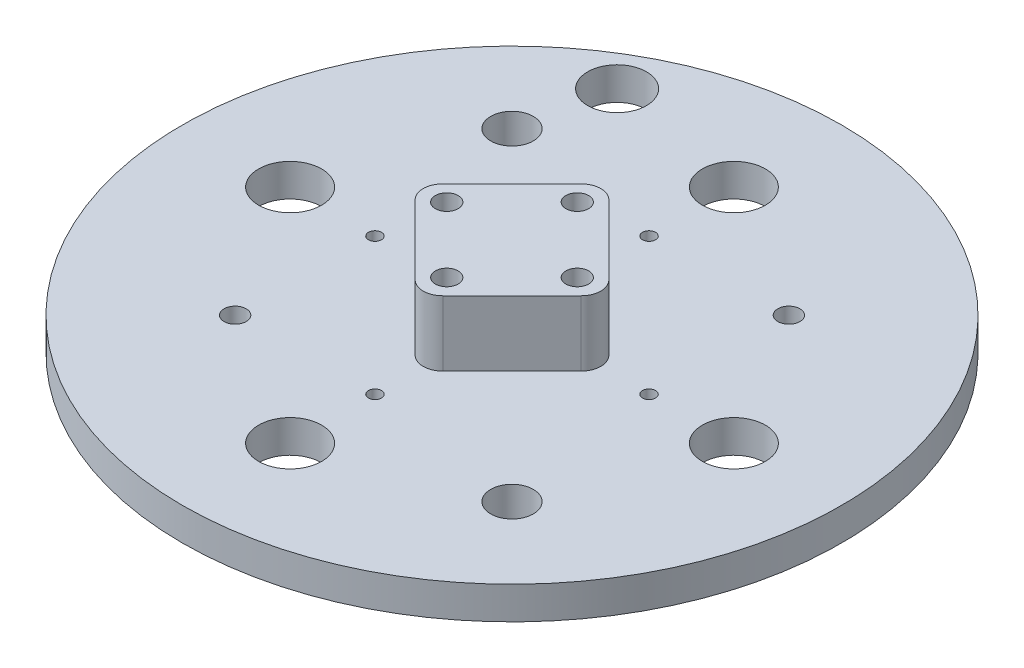
ISO-10303-21;
HEADER;
FILE_DESCRIPTION(('STEP AP214'),'2;1');
FILE_NAME('part.step','',(''),(''),'','','');
FILE_SCHEMA(('AUTOMOTIVE_DESIGN { 1 0 10303 214 1 1 1 1 }'));
ENDSEC;
DATA;
#1=APPLICATION_CONTEXT('core data for automotive mechanical design processes');
#2=APPLICATION_PROTOCOL_DEFINITION('international standard','automotive_design',2000,#1);
#3=PRODUCT_CONTEXT('',#1,'mechanical');
#4=PRODUCT('Part','Part','',(#3));
#5=PRODUCT_RELATED_PRODUCT_CATEGORY('part','',(#4));
#6=PRODUCT_DEFINITION_FORMATION('','',#4);
#7=PRODUCT_DEFINITION_CONTEXT('part definition',#1,'design');
#8=PRODUCT_DEFINITION('design','',#6,#7);
#9=PRODUCT_DEFINITION_SHAPE('','',#8);
#10=(LENGTH_UNIT() NAMED_UNIT(*) SI_UNIT(.MILLI.,.METRE.));
#11=(NAMED_UNIT(*) PLANE_ANGLE_UNIT() SI_UNIT($,.RADIAN.));
#12=(NAMED_UNIT(*) SI_UNIT($,.STERADIAN.) SOLID_ANGLE_UNIT());
#13=UNCERTAINTY_MEASURE_WITH_UNIT(LENGTH_MEASURE(1.E-05),#10,'distance_accuracy_value','');
#14=(GEOMETRIC_REPRESENTATION_CONTEXT(3) GLOBAL_UNCERTAINTY_ASSIGNED_CONTEXT((#13)) GLOBAL_UNIT_ASSIGNED_CONTEXT((#10,
#11,#12)) REPRESENTATION_CONTEXT('',''));
#15=CARTESIAN_POINT('',(0.,0.,0.));
#16=DIRECTION('',(0.,0.,1.));
#17=DIRECTION('',(1.,0.,0.));
#18=AXIS2_PLACEMENT_3D('',#15,#16,#17);
#19=CARTESIAN_POINT('',(0.,5.,0.));
#20=DIRECTION('',(0.,-1.,0.));
#21=DIRECTION('',(0.,0.,-1.));
#22=AXIS2_PLACEMENT_3D('',#19,#20,#21);
#23=CYLINDRICAL_SURFACE('',#22,50.5);
#24=CARTESIAN_POINT('',(0.,5.,0.));
#25=DIRECTION('',(0.,1.,0.));
#26=DIRECTION('',(0.,0.,1.));
#27=AXIS2_PLACEMENT_3D('',#24,#25,#26);
#28=CIRCLE('',#27,50.5);
#29=CARTESIAN_POINT('',(0.,5.,50.5));
#30=VERTEX_POINT('',#29);
#31=EDGE_CURVE('E132',#30,#30,#28,.T.);
#32=ORIENTED_EDGE('',*,*,#31,.F.);
#33=EDGE_LOOP('',(#32));
#34=FACE_BOUND('',#33,.T.);
#35=CARTESIAN_POINT('',(0.,0.,0.));
#36=DIRECTION('',(0.,1.,0.));
#37=DIRECTION('',(0.,0.,1.));
#38=AXIS2_PLACEMENT_3D('',#35,#36,#37);
#39=CIRCLE('',#38,50.5);
#40=CARTESIAN_POINT('',(0.,0.,50.5));
#41=VERTEX_POINT('',#40);
#42=EDGE_CURVE('E135',#41,#41,#39,.T.);
#43=ORIENTED_EDGE('',*,*,#42,.T.);
#44=EDGE_LOOP('',(#43));
#45=FACE_BOUND('',#44,.T.);
#46=ADVANCED_FACE('F34',(#34,#45),#23,.T.);
#47=CARTESIAN_POINT('',(0.,5.,0.));
#48=DIRECTION('',(0.,1.,0.));
#49=DIRECTION('',(0.,0.,1.));
#50=AXIS2_PLACEMENT_3D('',#47,#48,#49);
#51=PLANE('',#50);
#52=CARTESIAN_POINT('',(-22.0000000000001,5.,-38.1051177665153));
#53=DIRECTION('',(0.,1.,0.));
#54=DIRECTION('',(0.,0.,1.));
#55=AXIS2_PLACEMENT_3D('',#52,#53,#54);
#56=CIRCLE('',#55,4.50000000000001);
#57=CARTESIAN_POINT('',(-22.0000000000001,5.,-33.6051177665153));
#58=VERTEX_POINT('',#57);
#59=EDGE_CURVE('E276',#58,#58,#56,.F.);
#60=ORIENTED_EDGE('',*,*,#59,.T.);
#61=EDGE_LOOP('',(#60));
#62=FACE_BOUND('',#61,.T.);
#63=CARTESIAN_POINT('',(0.,5.,-21.));
#64=DIRECTION('',(0.,1.,0.));
#65=DIRECTION('',(0.,0.,1.));
#66=AXIS2_PLACEMENT_3D('',#63,#64,#65);
#67=CIRCLE('',#66,1.);
#68=CARTESIAN_POINT('',(0.,5.,-20.));
#69=VERTEX_POINT('',#68);
#70=EDGE_CURVE('E142',#69,#69,#67,.T.);
#71=ORIENTED_EDGE('',*,*,#70,.F.);
#72=EDGE_LOOP('',(#71));
#73=FACE_BOUND('',#72,.T.);
#74=CARTESIAN_POINT('',(-21.,5.,0.));
#75=DIRECTION('',(0.,1.,0.));
#76=DIRECTION('',(0.,0.,1.));
#77=AXIS2_PLACEMENT_3D('',#74,#75,#76);
#78=CIRCLE('',#77,1.);
#79=CARTESIAN_POINT('',(-21.,5.,1.));
#80=VERTEX_POINT('',#79);
#81=EDGE_CURVE('E279',#80,#80,#78,.T.);
#82=ORIENTED_EDGE('',*,*,#81,.F.);
#83=EDGE_LOOP('',(#82));
#84=FACE_BOUND('',#83,.T.);
#85=CARTESIAN_POINT('',(21.,5.,0.));
#86=DIRECTION('',(0.,1.,0.));
#87=DIRECTION('',(0.,0.,1.));
#88=AXIS2_PLACEMENT_3D('',#85,#86,#87);
#89=CIRCLE('',#88,1.);
#90=CARTESIAN_POINT('',(21.,5.,1.));
#91=VERTEX_POINT('',#90);
#92=EDGE_CURVE('E275',#91,#91,#89,.T.);
#93=ORIENTED_EDGE('',*,*,#92,.F.);
#94=EDGE_LOOP('',(#93));
#95=FACE_BOUND('',#94,.T.);
#96=CARTESIAN_POINT('',(0.,5.,21.));
#97=DIRECTION('',(0.,1.,0.));
#98=DIRECTION('',(0.,0.,1.));
#99=AXIS2_PLACEMENT_3D('',#96,#97,#98);
#100=CIRCLE('',#99,1.);
#101=CARTESIAN_POINT('',(0.,5.,22.));
#102=VERTEX_POINT('',#101);
#103=EDGE_CURVE('E272',#102,#102,#100,.T.);
#104=ORIENTED_EDGE('',*,*,#103,.F.);
#105=EDGE_LOOP('',(#104));
#106=FACE_BOUND('',#105,.T.);
#107=CARTESIAN_POINT('',(34.,5.,0.));
#108=DIRECTION('',(0.,1.,0.));
#109=DIRECTION('',(0.,0.,1.));
#110=AXIS2_PLACEMENT_3D('',#107,#108,#109);
#111=CIRCLE('',#110,4.826);
#112=CARTESIAN_POINT('',(34.,5.,4.826));
#113=VERTEX_POINT('',#112);
#114=EDGE_CURVE('E267',#113,#113,#111,.T.);
#115=ORIENTED_EDGE('',*,*,#114,.F.);
#116=EDGE_LOOP('',(#115));
#117=FACE_BOUND('',#116,.T.);
#118=CARTESIAN_POINT('',(0.,5.,-34.));
#119=DIRECTION('',(0.,1.,0.));
#120=DIRECTION('',(0.,0.,1.));
#121=AXIS2_PLACEMENT_3D('',#118,#119,#120);
#122=CIRCLE('',#121,4.826);
#123=CARTESIAN_POINT('',(0.,5.,-29.174));
#124=VERTEX_POINT('',#123);
#125=EDGE_CURVE('E261',#124,#124,#122,.T.);
#126=ORIENTED_EDGE('',*,*,#125,.F.);
#127=EDGE_LOOP('',(#126));
#128=FACE_BOUND('',#127,.T.);
#129=CARTESIAN_POINT('',(-34.,5.,0.));
#130=DIRECTION('',(0.,1.,0.));
#131=DIRECTION('',(0.,0.,1.));
#132=AXIS2_PLACEMENT_3D('',#129,#130,#131);
#133=CIRCLE('',#132,4.826);
#134=CARTESIAN_POINT('',(-34.,5.,4.826));
#135=VERTEX_POINT('',#134);
#136=EDGE_CURVE('E255',#135,#135,#133,.T.);
#137=ORIENTED_EDGE('',*,*,#136,.F.);
#138=EDGE_LOOP('',(#137));
#139=FACE_BOUND('',#138,.T.);
#140=CARTESIAN_POINT('',(0.,5.,34.));
#141=DIRECTION('',(0.,1.,0.));
#142=DIRECTION('',(0.,0.,1.));
#143=AXIS2_PLACEMENT_3D('',#140,#141,#142);
#144=CIRCLE('',#143,4.826);
#145=CARTESIAN_POINT('',(0.,5.,38.826));
#146=VERTEX_POINT('',#145);
#147=EDGE_CURVE('E151',#146,#146,#144,.T.);
#148=ORIENTED_EDGE('',*,*,#147,.F.);
#149=EDGE_LOOP('',(#148));
#150=FACE_BOUND('',#149,.T.);
#151=CARTESIAN_POINT('',(24.7487373415292,5.,24.7487373415291));
#152=DIRECTION('',(0.,1.,0.));
#153=DIRECTION('',(0.,0.,-1.));
#154=AXIS2_PLACEMENT_3D('',#151,#152,#153);
#155=CIRCLE('',#154,3.26390000000001);
#156=CARTESIAN_POINT('',(24.7487373415292,5.,21.4848373415291));
#157=VERTEX_POINT('',#156);
#158=EDGE_CURVE('E232',#157,#157,#155,.T.);
#159=ORIENTED_EDGE('',*,*,#158,.F.);
#160=EDGE_LOOP('',(#159));
#161=FACE_BOUND('',#160,.T.);
#162=CARTESIAN_POINT('',(-24.7487373415292,5.,-24.7487373415291));
#163=DIRECTION('',(0.,1.,0.));
#164=DIRECTION('',(0.,0.,1.));
#165=AXIS2_PLACEMENT_3D('',#162,#163,#164);
#166=CIRCLE('',#165,3.2639);
#167=CARTESIAN_POINT('',(-24.7487373415292,5.,-21.4848373415291));
#168=VERTEX_POINT('',#167);
#169=EDGE_CURVE('E239',#168,#168,#166,.T.);
#170=ORIENTED_EDGE('',*,*,#169,.F.);
#171=EDGE_LOOP('',(#170));
#172=FACE_BOUND('',#171,.T.);
#173=CARTESIAN_POINT('',(-21.2132034355964,5.,21.2132034355965));
#174=DIRECTION('',(0.,1.,0.));
#175=DIRECTION('',(0.,0.,-1.));
#176=AXIS2_PLACEMENT_3D('',#173,#174,#175);
#177=CIRCLE('',#176,1.7);
#178=CARTESIAN_POINT('',(-21.2132034355964,5.,19.5132034355965));
#179=VERTEX_POINT('',#178);
#180=EDGE_CURVE('E245',#179,#179,#177,.T.);
#181=ORIENTED_EDGE('',*,*,#180,.F.);
#182=EDGE_LOOP('',(#181));
#183=FACE_BOUND('',#182,.T.);
#184=CARTESIAN_POINT('',(21.2132034355964,5.,-21.2132034355965));
#185=DIRECTION('',(0.,1.,0.));
#186=DIRECTION('',(0.,0.,1.));
#187=AXIS2_PLACEMENT_3D('',#184,#185,#186);
#188=CIRCLE('',#187,1.7);
#189=CARTESIAN_POINT('',(21.2132034355964,5.,-19.5132034355965));
#190=VERTEX_POINT('',#189);
#191=EDGE_CURVE('E226',#190,#190,#188,.T.);
#192=ORIENTED_EDGE('',*,*,#191,.F.);
#193=EDGE_LOOP('',(#192));
#194=FACE_BOUND('',#193,.T.);
#195=DIRECTION('',(0.707106781186548,0.,0.707106781186547));
#196=VECTOR('',#195,1.);
#197=CARTESIAN_POINT('',(0.,5.,14.8492424049175));
#198=LINE('',#197,#196);
#199=CARTESIAN_POINT('',(-12.7279220613579,5.,2.12132034355965));
#200=VERTEX_POINT('',#199);
#201=CARTESIAN_POINT('',(-2.12132034355964,5.,12.7279220613579));
#202=VERTEX_POINT('',#201);
#203=EDGE_CURVE('E181',#200,#202,#198,.T.);
#204=ORIENTED_EDGE('',*,*,#203,.F.);
#205=CARTESIAN_POINT('',(-10.6066017177982,5.,0.));
#206=DIRECTION('',(0.,1.,0.));
#207=DIRECTION('',(0.,0.,1.));
#208=AXIS2_PLACEMENT_3D('',#205,#206,#207);
#209=CIRCLE('',#208,3.);
#210=CARTESIAN_POINT('',(-12.7279220613579,5.,-2.12132034355964));
#211=VERTEX_POINT('',#210);
#212=EDGE_CURVE('E42',#200,#211,#209,.F.);
#213=ORIENTED_EDGE('',*,*,#212,.T.);
#214=DIRECTION('',(-0.707106781186548,0.,0.707106781186548));
#215=VECTOR('',#214,1.);
#216=CARTESIAN_POINT('',(-14.8492424049175,5.,0.));
#217=LINE('',#216,#215);
#218=CARTESIAN_POINT('',(-2.12132034355964,5.,-12.7279220613579));
#219=VERTEX_POINT('',#218);
#220=EDGE_CURVE('E114',#219,#211,#217,.T.);
#221=ORIENTED_EDGE('',*,*,#220,.F.);
#222=CARTESIAN_POINT('',(0.,5.,-10.6066017177982));
#223=DIRECTION('',(0.,1.,0.));
#224=DIRECTION('',(0.,0.,1.));
#225=AXIS2_PLACEMENT_3D('',#222,#223,#224);
#226=CIRCLE('',#225,3.);
#227=CARTESIAN_POINT('',(2.12132034355964,5.,-12.7279220613579));
#228=VERTEX_POINT('',#227);
#229=EDGE_CURVE('E98',#219,#228,#226,.F.);
#230=ORIENTED_EDGE('',*,*,#229,.T.);
#231=DIRECTION('',(-0.707106781186548,0.,-0.707106781186547));
#232=VECTOR('',#231,1.);
#233=CARTESIAN_POINT('',(14.8492424049175,5.,0.));
#234=LINE('',#233,#232);
#235=CARTESIAN_POINT('',(12.7279220613579,5.,-2.12132034355964));
#236=VERTEX_POINT('',#235);
#237=EDGE_CURVE('E123',#236,#228,#234,.T.);
#238=ORIENTED_EDGE('',*,*,#237,.F.);
#239=CARTESIAN_POINT('',(10.6066017177982,5.,0.));
#240=DIRECTION('',(0.,1.,0.));
#241=DIRECTION('',(0.,0.,1.));
#242=AXIS2_PLACEMENT_3D('',#239,#240,#241);
#243=CIRCLE('',#242,3.);
#244=CARTESIAN_POINT('',(12.7279220613579,5.,2.12132034355964));
#245=VERTEX_POINT('',#244);
#246=EDGE_CURVE('E107',#236,#245,#243,.F.);
#247=ORIENTED_EDGE('',*,*,#246,.T.);
#248=DIRECTION('',(0.707106781186548,0.,-0.707106781186547));
#249=VECTOR('',#248,1.);
#250=CARTESIAN_POINT('',(0.,5.,14.8492424049175));
#251=LINE('',#250,#249);
#252=CARTESIAN_POINT('',(2.12132034355964,5.,12.7279220613579));
#253=VERTEX_POINT('',#252);
#254=EDGE_CURVE('E128',#253,#245,#251,.T.);
#255=ORIENTED_EDGE('',*,*,#254,.F.);
#256=CARTESIAN_POINT('',(0.,5.,10.6066017177982));
#257=DIRECTION('',(0.,1.,0.));
#258=DIRECTION('',(0.,0.,1.));
#259=AXIS2_PLACEMENT_3D('',#256,#257,#258);
#260=CIRCLE('',#259,3.);
#261=EDGE_CURVE('E11',#253,#202,#260,.F.);
#262=ORIENTED_EDGE('',*,*,#261,.T.);
#263=EDGE_LOOP('',(#204,#213,#221,#230,#238,#247,#255,#262));
#264=FACE_BOUND('',#263,.T.);
#265=ORIENTED_EDGE('',*,*,#31,.T.);
#266=EDGE_LOOP('',(#265));
#267=FACE_BOUND('',#266,.T.);
#268=ADVANCED_FACE('F120',(#62,#73,#84,#95,#106,#117,#128,#139,#150,#161,#172,#183,#194,#264,
#267),#51,.T.);
#269=CARTESIAN_POINT('',(0.,0.,0.));
#270=DIRECTION('',(0.,1.,0.));
#271=DIRECTION('',(0.,0.,1.));
#272=AXIS2_PLACEMENT_3D('',#269,#270,#271);
#273=PLANE('',#272);
#274=CARTESIAN_POINT('',(-22.0000000000001,0.,-38.1051177665153));
#275=DIRECTION('',(0.,1.,0.));
#276=DIRECTION('',(0.,0.,1.));
#277=AXIS2_PLACEMENT_3D('',#274,#275,#276);
#278=CIRCLE('',#277,4.50000000000001);
#279=CARTESIAN_POINT('',(-22.0000000000001,0.,-33.6051177665153));
#280=VERTEX_POINT('',#279);
#281=EDGE_CURVE('E286',#280,#280,#278,.T.);
#282=ORIENTED_EDGE('',*,*,#281,.T.);
#283=EDGE_LOOP('',(#282));
#284=FACE_BOUND('',#283,.T.);
#285=CARTESIAN_POINT('',(0.,0.,-21.));
#286=DIRECTION('',(0.,1.,0.));
#287=DIRECTION('',(0.,0.,1.));
#288=AXIS2_PLACEMENT_3D('',#285,#286,#287);
#289=CIRCLE('',#288,1.);
#290=CARTESIAN_POINT('',(0.,0.,-20.));
#291=VERTEX_POINT('',#290);
#292=EDGE_CURVE('E148',#291,#291,#289,.T.);
#293=ORIENTED_EDGE('',*,*,#292,.T.);
#294=EDGE_LOOP('',(#293));
#295=FACE_BOUND('',#294,.T.);
#296=CARTESIAN_POINT('',(-21.,0.,0.));
#297=DIRECTION('',(0.,1.,0.));
#298=DIRECTION('',(0.,0.,1.));
#299=AXIS2_PLACEMENT_3D('',#296,#297,#298);
#300=CIRCLE('',#299,1.);
#301=CARTESIAN_POINT('',(-21.,0.,1.));
#302=VERTEX_POINT('',#301);
#303=EDGE_CURVE('E145',#302,#302,#300,.T.);
#304=ORIENTED_EDGE('',*,*,#303,.T.);
#305=EDGE_LOOP('',(#304));
#306=FACE_BOUND('',#305,.T.);
#307=CARTESIAN_POINT('',(21.,0.,0.));
#308=DIRECTION('',(0.,1.,0.));
#309=DIRECTION('',(0.,0.,1.));
#310=AXIS2_PLACEMENT_3D('',#307,#308,#309);
#311=CIRCLE('',#310,1.);
#312=CARTESIAN_POINT('',(21.,0.,1.));
#313=VERTEX_POINT('',#312);
#314=EDGE_CURVE('E141',#313,#313,#311,.T.);
#315=ORIENTED_EDGE('',*,*,#314,.T.);
#316=EDGE_LOOP('',(#315));
#317=FACE_BOUND('',#316,.T.);
#318=CARTESIAN_POINT('',(0.,0.,21.));
#319=DIRECTION('',(0.,1.,0.));
#320=DIRECTION('',(0.,0.,1.));
#321=AXIS2_PLACEMENT_3D('',#318,#319,#320);
#322=CIRCLE('',#321,1.);
#323=CARTESIAN_POINT('',(0.,0.,22.));
#324=VERTEX_POINT('',#323);
#325=EDGE_CURVE('E138',#324,#324,#322,.T.);
#326=ORIENTED_EDGE('',*,*,#325,.T.);
#327=EDGE_LOOP('',(#326));
#328=FACE_BOUND('',#327,.T.);
#329=CARTESIAN_POINT('',(34.,0.,0.));
#330=DIRECTION('',(0.,1.,0.));
#331=DIRECTION('',(0.,0.,1.));
#332=AXIS2_PLACEMENT_3D('',#329,#330,#331);
#333=CIRCLE('',#332,4.826);
#334=CARTESIAN_POINT('',(34.,0.,4.826));
#335=VERTEX_POINT('',#334);
#336=EDGE_CURVE('E236',#335,#335,#333,.T.);
#337=ORIENTED_EDGE('',*,*,#336,.T.);
#338=EDGE_LOOP('',(#337));
#339=FACE_BOUND('',#338,.T.);
#340=CARTESIAN_POINT('',(0.,0.,-34.));
#341=DIRECTION('',(0.,1.,0.));
#342=DIRECTION('',(0.,0.,1.));
#343=AXIS2_PLACEMENT_3D('',#340,#341,#342);
#344=CIRCLE('',#343,4.826);
#345=CARTESIAN_POINT('',(0.,0.,-29.174));
#346=VERTEX_POINT('',#345);
#347=EDGE_CURVE('E264',#346,#346,#344,.T.);
#348=ORIENTED_EDGE('',*,*,#347,.T.);
#349=EDGE_LOOP('',(#348));
#350=FACE_BOUND('',#349,.T.);
#351=CARTESIAN_POINT('',(-34.,0.,0.));
#352=DIRECTION('',(0.,1.,0.));
#353=DIRECTION('',(0.,0.,1.));
#354=AXIS2_PLACEMENT_3D('',#351,#352,#353);
#355=CIRCLE('',#354,4.826);
#356=CARTESIAN_POINT('',(-34.,0.,4.826));
#357=VERTEX_POINT('',#356);
#358=EDGE_CURVE('E258',#357,#357,#355,.T.);
#359=ORIENTED_EDGE('',*,*,#358,.T.);
#360=EDGE_LOOP('',(#359));
#361=FACE_BOUND('',#360,.T.);
#362=CARTESIAN_POINT('',(0.,0.,34.));
#363=DIRECTION('',(0.,1.,0.));
#364=DIRECTION('',(0.,0.,1.));
#365=AXIS2_PLACEMENT_3D('',#362,#363,#364);
#366=CIRCLE('',#365,4.826);
#367=CARTESIAN_POINT('',(0.,0.,38.826));
#368=VERTEX_POINT('',#367);
#369=EDGE_CURVE('E252',#368,#368,#366,.T.);
#370=ORIENTED_EDGE('',*,*,#369,.T.);
#371=EDGE_LOOP('',(#370));
#372=FACE_BOUND('',#371,.T.);
#373=CARTESIAN_POINT('',(24.7487373415292,0.,24.7487373415291));
#374=DIRECTION('',(0.,1.,0.));
#375=DIRECTION('',(0.,0.,-1.));
#376=AXIS2_PLACEMENT_3D('',#373,#374,#375);
#377=CIRCLE('',#376,3.26390000000001);
#378=CARTESIAN_POINT('',(24.7487373415292,0.,21.4848373415291));
#379=VERTEX_POINT('',#378);
#380=EDGE_CURVE('E235',#379,#379,#377,.T.);
#381=ORIENTED_EDGE('',*,*,#380,.T.);
#382=EDGE_LOOP('',(#381));
#383=FACE_BOUND('',#382,.T.);
#384=CARTESIAN_POINT('',(-24.7487373415292,0.,-24.7487373415291));
#385=DIRECTION('',(0.,1.,0.));
#386=DIRECTION('',(0.,0.,1.));
#387=AXIS2_PLACEMENT_3D('',#384,#385,#386);
#388=CIRCLE('',#387,3.2639);
#389=CARTESIAN_POINT('',(-24.7487373415292,0.,-21.4848373415291));
#390=VERTEX_POINT('',#389);
#391=EDGE_CURVE('E242',#390,#390,#388,.T.);
#392=ORIENTED_EDGE('',*,*,#391,.T.);
#393=EDGE_LOOP('',(#392));
#394=FACE_BOUND('',#393,.T.);
#395=CARTESIAN_POINT('',(-21.2132034355964,0.,21.2132034355965));
#396=DIRECTION('',(0.,1.,0.));
#397=DIRECTION('',(0.,0.,-1.));
#398=AXIS2_PLACEMENT_3D('',#395,#396,#397);
#399=CIRCLE('',#398,1.7);
#400=CARTESIAN_POINT('',(-21.2132034355964,0.,19.5132034355965));
#401=VERTEX_POINT('',#400);
#402=EDGE_CURVE('E229',#401,#401,#399,.T.);
#403=ORIENTED_EDGE('',*,*,#402,.T.);
#404=EDGE_LOOP('',(#403));
#405=FACE_BOUND('',#404,.T.);
#406=CARTESIAN_POINT('',(21.2132034355964,0.,-21.2132034355965));
#407=DIRECTION('',(0.,1.,0.));
#408=DIRECTION('',(0.,0.,1.));
#409=AXIS2_PLACEMENT_3D('',#406,#407,#408);
#410=CIRCLE('',#409,1.7);
#411=CARTESIAN_POINT('',(21.2132034355964,0.,-19.5132034355965));
#412=VERTEX_POINT('',#411);
#413=EDGE_CURVE('E223',#412,#412,#410,.T.);
#414=ORIENTED_EDGE('',*,*,#413,.T.);
#415=EDGE_LOOP('',(#414));
#416=FACE_BOUND('',#415,.T.);
#417=ORIENTED_EDGE('',*,*,#42,.F.);
#418=EDGE_LOOP('',(#417));
#419=FACE_BOUND('',#418,.T.);
#420=ADVANCED_FACE('F290',(#284,#295,#306,#317,#328,#339,#350,#361,#372,#383,#394,#405,#416,
#419),#273,.F.);
#421=CARTESIAN_POINT('',(0.,15.,0.));
#422=DIRECTION('',(0.,-1.,0.));
#423=DIRECTION('',(0.,0.,-1.));
#424=AXIS2_PLACEMENT_3D('',#421,#422,#423);
#425=PLANE('',#424);
#426=DIRECTION('',(-0.707106781186548,0.,-0.707106781186547));
#427=VECTOR('',#426,1.);
#428=CARTESIAN_POINT('',(14.8492424049175,15.,0.));
#429=LINE('',#428,#427);
#430=CARTESIAN_POINT('',(12.7279220613579,15.,-2.12132034355964));
#431=VERTEX_POINT('',#430);
#432=CARTESIAN_POINT('',(2.12132034355964,15.,-12.7279220613579));
#433=VERTEX_POINT('',#432);
#434=EDGE_CURVE('E189',#431,#433,#429,.T.);
#435=ORIENTED_EDGE('',*,*,#434,.T.);
#436=CARTESIAN_POINT('',(0.,15.,-10.6066017177982));
#437=DIRECTION('',(0.,-1.,0.));
#438=DIRECTION('',(0.,0.,-1.));
#439=AXIS2_PLACEMENT_3D('',#436,#437,#438);
#440=CIRCLE('',#439,3.);
#441=CARTESIAN_POINT('',(-2.12132034355964,15.,-12.7279220613579));
#442=VERTEX_POINT('',#441);
#443=EDGE_CURVE('E162',#433,#442,#440,.F.);
#444=ORIENTED_EDGE('',*,*,#443,.T.);
#445=DIRECTION('',(-0.707106781186548,0.,0.707106781186548));
#446=VECTOR('',#445,1.);
#447=CARTESIAN_POINT('',(-14.8492424049175,15.,0.));
#448=LINE('',#447,#446);
#449=CARTESIAN_POINT('',(-12.7279220613579,15.,-2.12132034355964));
#450=VERTEX_POINT('',#449);
#451=EDGE_CURVE('E116',#442,#450,#448,.T.);
#452=ORIENTED_EDGE('',*,*,#451,.T.);
#453=CARTESIAN_POINT('',(-10.6066017177982,15.,0.));
#454=DIRECTION('',(0.,-1.,0.));
#455=DIRECTION('',(0.,0.,-1.));
#456=AXIS2_PLACEMENT_3D('',#453,#454,#455);
#457=CIRCLE('',#456,3.);
#458=CARTESIAN_POINT('',(-12.7279220613579,15.,2.12132034355965));
#459=VERTEX_POINT('',#458);
#460=EDGE_CURVE('E158',#450,#459,#457,.F.);
#461=ORIENTED_EDGE('',*,*,#460,.T.);
#462=DIRECTION('',(0.707106781186548,0.,0.707106781186547));
#463=VECTOR('',#462,1.);
#464=CARTESIAN_POINT('',(0.,15.,14.8492424049175));
#465=LINE('',#464,#463);
#466=CARTESIAN_POINT('',(-2.12132034355964,15.,12.7279220613579));
#467=VERTEX_POINT('',#466);
#468=EDGE_CURVE('E122',#459,#467,#465,.T.);
#469=ORIENTED_EDGE('',*,*,#468,.T.);
#470=CARTESIAN_POINT('',(0.,15.,10.6066017177982));
#471=DIRECTION('',(0.,-1.,0.));
#472=DIRECTION('',(0.,0.,-1.));
#473=AXIS2_PLACEMENT_3D('',#470,#471,#472);
#474=CIRCLE('',#473,3.);
#475=CARTESIAN_POINT('',(2.12132034355964,15.,12.7279220613579));
#476=VERTEX_POINT('',#475);
#477=EDGE_CURVE('E156',#467,#476,#474,.F.);
#478=ORIENTED_EDGE('',*,*,#477,.T.);
#479=DIRECTION('',(0.707106781186548,0.,-0.707106781186547));
#480=VECTOR('',#479,1.);
#481=CARTESIAN_POINT('',(0.,15.,14.8492424049175));
#482=LINE('',#481,#480);
#483=CARTESIAN_POINT('',(12.7279220613579,15.,2.12132034355964));
#484=VERTEX_POINT('',#483);
#485=EDGE_CURVE('E126',#476,#484,#482,.T.);
#486=ORIENTED_EDGE('',*,*,#485,.T.);
#487=CARTESIAN_POINT('',(10.6066017177982,15.,0.));
#488=DIRECTION('',(0.,-1.,0.));
#489=DIRECTION('',(0.,0.,-1.));
#490=AXIS2_PLACEMENT_3D('',#487,#488,#489);
#491=CIRCLE('',#490,3.);
#492=EDGE_CURVE('E160',#484,#431,#491,.F.);
#493=ORIENTED_EDGE('',*,*,#492,.T.);
#494=EDGE_LOOP('',(#435,#444,#452,#461,#469,#478,#486,#493));
#495=FACE_BOUND('',#494,.T.);
#496=CARTESIAN_POINT('',(10.,15.,0.));
#497=DIRECTION('',(0.,1.,0.));
#498=DIRECTION('',(0.,0.,1.));
#499=AXIS2_PLACEMENT_3D('',#496,#497,#498);
#500=CIRCLE('',#499,1.75);
#501=CARTESIAN_POINT('',(10.,15.,1.75));
#502=VERTEX_POINT('',#501);
#503=EDGE_CURVE('E196',#502,#502,#500,.T.);
#504=ORIENTED_EDGE('',*,*,#503,.F.);
#505=EDGE_LOOP('',(#504));
#506=FACE_BOUND('',#505,.T.);
#507=CARTESIAN_POINT('',(0.,15.,10.));
#508=DIRECTION('',(0.,1.,0.));
#509=DIRECTION('',(0.,0.,1.));
#510=AXIS2_PLACEMENT_3D('',#507,#508,#509);
#511=CIRCLE('',#510,1.75);
#512=CARTESIAN_POINT('',(0.,15.,11.75));
#513=VERTEX_POINT('',#512);
#514=EDGE_CURVE('E205',#513,#513,#511,.T.);
#515=ORIENTED_EDGE('',*,*,#514,.F.);
#516=EDGE_LOOP('',(#515));
#517=FACE_BOUND('',#516,.T.);
#518=CARTESIAN_POINT('',(-10.,15.,0.));
#519=DIRECTION('',(0.,1.,0.));
#520=DIRECTION('',(0.,0.,1.));
#521=AXIS2_PLACEMENT_3D('',#518,#519,#520);
#522=CIRCLE('',#521,1.75);
#523=CARTESIAN_POINT('',(-10.,15.,1.75));
#524=VERTEX_POINT('',#523);
#525=EDGE_CURVE('E211',#524,#524,#522,.T.);
#526=ORIENTED_EDGE('',*,*,#525,.F.);
#527=EDGE_LOOP('',(#526));
#528=FACE_BOUND('',#527,.T.);
#529=CARTESIAN_POINT('',(0.,15.,-10.));
#530=DIRECTION('',(0.,1.,0.));
#531=DIRECTION('',(0.,0.,1.));
#532=AXIS2_PLACEMENT_3D('',#529,#530,#531);
#533=CIRCLE('',#532,1.75);
#534=CARTESIAN_POINT('',(0.,15.,-8.25));
#535=VERTEX_POINT('',#534);
#536=EDGE_CURVE('E217',#535,#535,#533,.T.);
#537=ORIENTED_EDGE('',*,*,#536,.F.);
#538=EDGE_LOOP('',(#537));
#539=FACE_BOUND('',#538,.T.);
#540=ADVANCED_FACE('F187',(#495,#506,#517,#528,#539),#425,.F.);
#541=CARTESIAN_POINT('',(0.,15.,14.8492424049175));
#542=DIRECTION('',(0.707106781186547,0.,-0.707106781186548));
#543=DIRECTION('',(-0.707106781186548,0.,-0.707106781186547));
#544=AXIS2_PLACEMENT_3D('',#541,#542,#543);
#545=PLANE('',#544);
#546=ORIENTED_EDGE('',*,*,#468,.F.);
#547=DIRECTION('',(0.,-1.,0.));
#548=VECTOR('',#547,1.);
#549=CARTESIAN_POINT('',(-12.7279220613579,15.,2.12132034355965));
#550=LINE('',#549,#548);
#551=EDGE_CURVE('E108',#459,#200,#550,.T.);
#552=ORIENTED_EDGE('',*,*,#551,.T.);
#553=ORIENTED_EDGE('',*,*,#203,.T.);
#554=DIRECTION('',(0.,-1.,0.));
#555=VECTOR('',#554,1.);
#556=CARTESIAN_POINT('',(-2.12132034355964,15.,12.7279220613579));
#557=LINE('',#556,#555);
#558=EDGE_CURVE('E169',#202,#467,#557,.F.);
#559=ORIENTED_EDGE('',*,*,#558,.T.);
#560=EDGE_LOOP('',(#546,#552,#553,#559));
#561=FACE_BOUND('',#560,.T.);
#562=ADVANCED_FACE('F328',(#561),#545,.F.);
#563=CARTESIAN_POINT('',(0.,15.,14.8492424049175));
#564=DIRECTION('',(-0.707106781186547,0.,-0.707106781186548));
#565=DIRECTION('',(-0.707106781186548,0.,0.707106781186547));
#566=AXIS2_PLACEMENT_3D('',#563,#564,#565);
#567=PLANE('',#566);
#568=ORIENTED_EDGE('',*,*,#254,.T.);
#569=DIRECTION('',(0.,-1.,0.));
#570=VECTOR('',#569,1.);
#571=CARTESIAN_POINT('',(12.7279220613579,15.,2.12132034355964));
#572=LINE('',#571,#570);
#573=EDGE_CURVE('E167',#245,#484,#572,.F.);
#574=ORIENTED_EDGE('',*,*,#573,.T.);
#575=ORIENTED_EDGE('',*,*,#485,.F.);
#576=DIRECTION('',(0.,-1.,0.));
#577=VECTOR('',#576,1.);
#578=CARTESIAN_POINT('',(2.12132034355964,15.,12.7279220613579));
#579=LINE('',#578,#577);
#580=EDGE_CURVE('E164',#476,#253,#579,.T.);
#581=ORIENTED_EDGE('',*,*,#580,.T.);
#582=EDGE_LOOP('',(#568,#574,#575,#581));
#583=FACE_BOUND('',#582,.T.);
#584=ADVANCED_FACE('F177',(#583),#567,.F.);
#585=CARTESIAN_POINT('',(14.8492424049175,15.,0.));
#586=DIRECTION('',(-0.707106781186547,0.,0.707106781186548));
#587=DIRECTION('',(0.707106781186548,0.,0.707106781186547));
#588=AXIS2_PLACEMENT_3D('',#585,#586,#587);
#589=PLANE('',#588);
#590=ORIENTED_EDGE('',*,*,#237,.T.);
#591=DIRECTION('',(0.,-1.,0.));
#592=VECTOR('',#591,1.);
#593=CARTESIAN_POINT('',(2.12132034355964,15.,-12.7279220613579));
#594=LINE('',#593,#592);
#595=EDGE_CURVE('E103',#228,#433,#594,.F.);
#596=ORIENTED_EDGE('',*,*,#595,.T.);
#597=ORIENTED_EDGE('',*,*,#434,.F.);
#598=DIRECTION('',(0.,-1.,0.));
#599=VECTOR('',#598,1.);
#600=CARTESIAN_POINT('',(12.7279220613579,15.,-2.12132034355964));
#601=LINE('',#600,#599);
#602=EDGE_CURVE('E117',#431,#236,#601,.T.);
#603=ORIENTED_EDGE('',*,*,#602,.T.);
#604=EDGE_LOOP('',(#590,#596,#597,#603));
#605=FACE_BOUND('',#604,.T.);
#606=ADVANCED_FACE('F191',(#605),#589,.F.);
#607=CARTESIAN_POINT('',(-14.8492424049175,15.,0.));
#608=DIRECTION('',(0.707106781186548,0.,0.707106781186548));
#609=DIRECTION('',(0.707106781186548,0.,-0.707106781186548));
#610=AXIS2_PLACEMENT_3D('',#607,#608,#609);
#611=PLANE('',#610);
#612=ORIENTED_EDGE('',*,*,#451,.F.);
#613=DIRECTION('',(0.,-1.,0.));
#614=VECTOR('',#613,1.);
#615=CARTESIAN_POINT('',(-2.12132034355964,15.,-12.7279220613579));
#616=LINE('',#615,#614);
#617=EDGE_CURVE('E102',#442,#219,#616,.T.);
#618=ORIENTED_EDGE('',*,*,#617,.T.);
#619=ORIENTED_EDGE('',*,*,#220,.T.);
#620=DIRECTION('',(0.,-1.,0.));
#621=VECTOR('',#620,1.);
#622=CARTESIAN_POINT('',(-12.7279220613579,15.,-2.12132034355964));
#623=LINE('',#622,#621);
#624=EDGE_CURVE('E118',#211,#450,#623,.F.);
#625=ORIENTED_EDGE('',*,*,#624,.T.);
#626=EDGE_LOOP('',(#612,#618,#619,#625));
#627=FACE_BOUND('',#626,.T.);
#628=ADVANCED_FACE('F113',(#627),#611,.F.);
#629=CARTESIAN_POINT('',(10.,15.,0.));
#630=DIRECTION('',(0.,-1.,0.));
#631=DIRECTION('',(0.,0.,-1.));
#632=AXIS2_PLACEMENT_3D('',#629,#630,#631);
#633=CYLINDRICAL_SURFACE('',#632,1.75);
#634=ORIENTED_EDGE('',*,*,#503,.T.);
#635=EDGE_LOOP('',(#634));
#636=FACE_BOUND('',#635,.T.);
#637=CARTESIAN_POINT('',(10.,5.,0.));
#638=DIRECTION('',(0.,1.,0.));
#639=DIRECTION('',(0.,0.,1.));
#640=AXIS2_PLACEMENT_3D('',#637,#638,#639);
#641=CIRCLE('',#640,1.75);
#642=CARTESIAN_POINT('',(10.,5.,1.75));
#643=VERTEX_POINT('',#642);
#644=EDGE_CURVE('E200',#643,#643,#641,.T.);
#645=ORIENTED_EDGE('',*,*,#644,.F.);
#646=EDGE_LOOP('',(#645));
#647=FACE_BOUND('',#646,.T.);
#648=ADVANCED_FACE('F341',(#636,#647),#633,.F.);
#649=CARTESIAN_POINT('',(0.,15.,10.));
#650=DIRECTION('',(0.,-1.,0.));
#651=DIRECTION('',(0.,0.,-1.));
#652=AXIS2_PLACEMENT_3D('',#649,#650,#651);
#653=CYLINDRICAL_SURFACE('',#652,1.75);
#654=ORIENTED_EDGE('',*,*,#514,.T.);
#655=EDGE_LOOP('',(#654));
#656=FACE_BOUND('',#655,.T.);
#657=CARTESIAN_POINT('',(0.,5.,10.));
#658=DIRECTION('',(0.,1.,0.));
#659=DIRECTION('',(0.,0.,1.));
#660=AXIS2_PLACEMENT_3D('',#657,#658,#659);
#661=CIRCLE('',#660,1.75);
#662=CARTESIAN_POINT('',(0.,5.,11.75));
#663=VERTEX_POINT('',#662);
#664=EDGE_CURVE('E208',#663,#663,#661,.T.);
#665=ORIENTED_EDGE('',*,*,#664,.F.);
#666=EDGE_LOOP('',(#665));
#667=FACE_BOUND('',#666,.T.);
#668=ADVANCED_FACE('F345',(#656,#667),#653,.F.);
#669=CARTESIAN_POINT('',(-10.,15.,0.));
#670=DIRECTION('',(0.,-1.,0.));
#671=DIRECTION('',(0.,0.,-1.));
#672=AXIS2_PLACEMENT_3D('',#669,#670,#671);
#673=CYLINDRICAL_SURFACE('',#672,1.75);
#674=ORIENTED_EDGE('',*,*,#525,.T.);
#675=EDGE_LOOP('',(#674));
#676=FACE_BOUND('',#675,.T.);
#677=CARTESIAN_POINT('',(-10.,5.,0.));
#678=DIRECTION('',(0.,1.,0.));
#679=DIRECTION('',(0.,0.,1.));
#680=AXIS2_PLACEMENT_3D('',#677,#678,#679);
#681=CIRCLE('',#680,1.75);
#682=CARTESIAN_POINT('',(-10.,5.,1.75));
#683=VERTEX_POINT('',#682);
#684=EDGE_CURVE('E214',#683,#683,#681,.T.);
#685=ORIENTED_EDGE('',*,*,#684,.F.);
#686=EDGE_LOOP('',(#685));
#687=FACE_BOUND('',#686,.T.);
#688=ADVANCED_FACE('F348',(#676,#687),#673,.F.);
#689=CARTESIAN_POINT('',(0.,15.,-10.));
#690=DIRECTION('',(0.,-1.,0.));
#691=DIRECTION('',(0.,0.,-1.));
#692=AXIS2_PLACEMENT_3D('',#689,#690,#691);
#693=CYLINDRICAL_SURFACE('',#692,1.75);
#694=ORIENTED_EDGE('',*,*,#536,.T.);
#695=EDGE_LOOP('',(#694));
#696=FACE_BOUND('',#695,.T.);
#697=CARTESIAN_POINT('',(0.,5.,-10.));
#698=DIRECTION('',(0.,1.,0.));
#699=DIRECTION('',(0.,0.,1.));
#700=AXIS2_PLACEMENT_3D('',#697,#698,#699);
#701=CIRCLE('',#700,1.75);
#702=CARTESIAN_POINT('',(0.,5.,-8.25));
#703=VERTEX_POINT('',#702);
#704=EDGE_CURVE('E220',#703,#703,#701,.T.);
#705=ORIENTED_EDGE('',*,*,#704,.F.);
#706=EDGE_LOOP('',(#705));
#707=FACE_BOUND('',#706,.T.);
#708=ADVANCED_FACE('F352',(#696,#707),#693,.F.);
#709=ORIENTED_EDGE('',*,*,#664,.T.);
#710=EDGE_LOOP('',(#709));
#711=FACE_BOUND('',#710,.T.);
#712=ADVANCED_FACE('F356',(#711),#51,.T.);
#713=ORIENTED_EDGE('',*,*,#644,.T.);
#714=EDGE_LOOP('',(#713));
#715=FACE_BOUND('',#714,.T.);
#716=ADVANCED_FACE('F546',(#715),#51,.T.);
#717=ORIENTED_EDGE('',*,*,#684,.T.);
#718=EDGE_LOOP('',(#717));
#719=FACE_BOUND('',#718,.T.);
#720=ADVANCED_FACE('F312',(#719),#51,.T.);
#721=ORIENTED_EDGE('',*,*,#704,.T.);
#722=EDGE_LOOP('',(#721));
#723=FACE_BOUND('',#722,.T.);
#724=ADVANCED_FACE('F313',(#723),#51,.T.);
#725=CARTESIAN_POINT('',(21.2132034355964,0.,-21.2132034355965));
#726=DIRECTION('',(0.,1.,0.));
#727=DIRECTION('',(0.,0.,1.));
#728=AXIS2_PLACEMENT_3D('',#725,#726,#727);
#729=CYLINDRICAL_SURFACE('',#728,1.7);
#730=ORIENTED_EDGE('',*,*,#413,.F.);
#731=EDGE_LOOP('',(#730));
#732=FACE_BOUND('',#731,.T.);
#733=ORIENTED_EDGE('',*,*,#191,.T.);
#734=EDGE_LOOP('',(#733));
#735=FACE_BOUND('',#734,.T.);
#736=ADVANCED_FACE('F358',(#732,#735),#729,.F.);
#737=CARTESIAN_POINT('',(-21.2132034355964,0.,21.2132034355965));
#738=DIRECTION('',(0.,1.,0.));
#739=DIRECTION('',(0.,0.,1.));
#740=AXIS2_PLACEMENT_3D('',#737,#738,#739);
#741=CYLINDRICAL_SURFACE('',#740,1.7);
#742=ORIENTED_EDGE('',*,*,#402,.F.);
#743=EDGE_LOOP('',(#742));
#744=FACE_BOUND('',#743,.T.);
#745=ORIENTED_EDGE('',*,*,#180,.T.);
#746=EDGE_LOOP('',(#745));
#747=FACE_BOUND('',#746,.T.);
#748=ADVANCED_FACE('F361',(#744,#747),#741,.F.);
#749=CARTESIAN_POINT('',(-24.7487373415292,0.,-24.7487373415291));
#750=DIRECTION('',(0.,1.,0.));
#751=DIRECTION('',(0.,0.,1.));
#752=AXIS2_PLACEMENT_3D('',#749,#750,#751);
#753=CYLINDRICAL_SURFACE('',#752,3.2639);
#754=ORIENTED_EDGE('',*,*,#391,.F.);
#755=EDGE_LOOP('',(#754));
#756=FACE_BOUND('',#755,.T.);
#757=ORIENTED_EDGE('',*,*,#169,.T.);
#758=EDGE_LOOP('',(#757));
#759=FACE_BOUND('',#758,.T.);
#760=ADVANCED_FACE('F367',(#756,#759),#753,.F.);
#761=CARTESIAN_POINT('',(24.7487373415292,0.,24.7487373415291));
#762=DIRECTION('',(0.,1.,0.));
#763=DIRECTION('',(0.,0.,1.));
#764=AXIS2_PLACEMENT_3D('',#761,#762,#763);
#765=CYLINDRICAL_SURFACE('',#764,3.26390000000001);
#766=ORIENTED_EDGE('',*,*,#380,.F.);
#767=EDGE_LOOP('',(#766));
#768=FACE_BOUND('',#767,.T.);
#769=ORIENTED_EDGE('',*,*,#158,.T.);
#770=EDGE_LOOP('',(#769));
#771=FACE_BOUND('',#770,.T.);
#772=ADVANCED_FACE('F363',(#768,#771),#765,.F.);
#773=CARTESIAN_POINT('',(0.,0.,34.));
#774=DIRECTION('',(0.,1.,0.));
#775=DIRECTION('',(0.,0.,1.));
#776=AXIS2_PLACEMENT_3D('',#773,#774,#775);
#777=CYLINDRICAL_SURFACE('',#776,4.826);
#778=ORIENTED_EDGE('',*,*,#369,.F.);
#779=EDGE_LOOP('',(#778));
#780=FACE_BOUND('',#779,.T.);
#781=ORIENTED_EDGE('',*,*,#147,.T.);
#782=EDGE_LOOP('',(#781));
#783=FACE_BOUND('',#782,.T.);
#784=ADVANCED_FACE('F366',(#780,#783),#777,.F.);
#785=CARTESIAN_POINT('',(-34.,0.,0.));
#786=DIRECTION('',(0.,1.,0.));
#787=DIRECTION('',(0.,0.,1.));
#788=AXIS2_PLACEMENT_3D('',#785,#786,#787);
#789=CYLINDRICAL_SURFACE('',#788,4.826);
#790=ORIENTED_EDGE('',*,*,#358,.F.);
#791=EDGE_LOOP('',(#790));
#792=FACE_BOUND('',#791,.T.);
#793=ORIENTED_EDGE('',*,*,#136,.T.);
#794=EDGE_LOOP('',(#793));
#795=FACE_BOUND('',#794,.T.);
#796=ADVANCED_FACE('F377',(#792,#795),#789,.F.);
#797=CARTESIAN_POINT('',(0.,0.,-34.));
#798=DIRECTION('',(0.,1.,0.));
#799=DIRECTION('',(0.,0.,1.));
#800=AXIS2_PLACEMENT_3D('',#797,#798,#799);
#801=CYLINDRICAL_SURFACE('',#800,4.826);
#802=ORIENTED_EDGE('',*,*,#347,.F.);
#803=EDGE_LOOP('',(#802));
#804=FACE_BOUND('',#803,.T.);
#805=ORIENTED_EDGE('',*,*,#125,.T.);
#806=EDGE_LOOP('',(#805));
#807=FACE_BOUND('',#806,.T.);
#808=ADVANCED_FACE('F381',(#804,#807),#801,.F.);
#809=CARTESIAN_POINT('',(34.,0.,0.));
#810=DIRECTION('',(0.,1.,0.));
#811=DIRECTION('',(0.,0.,1.));
#812=AXIS2_PLACEMENT_3D('',#809,#810,#811);
#813=CYLINDRICAL_SURFACE('',#812,4.826);
#814=ORIENTED_EDGE('',*,*,#336,.F.);
#815=EDGE_LOOP('',(#814));
#816=FACE_BOUND('',#815,.T.);
#817=ORIENTED_EDGE('',*,*,#114,.T.);
#818=EDGE_LOOP('',(#817));
#819=FACE_BOUND('',#818,.T.);
#820=ADVANCED_FACE('F385',(#816,#819),#813,.F.);
#821=CARTESIAN_POINT('',(0.,-5.,21.));
#822=DIRECTION('',(0.,1.,0.));
#823=DIRECTION('',(0.,0.,1.));
#824=AXIS2_PLACEMENT_3D('',#821,#822,#823);
#825=CYLINDRICAL_SURFACE('',#824,1.);
#826=ORIENTED_EDGE('',*,*,#103,.T.);
#827=EDGE_LOOP('',(#826));
#828=FACE_BOUND('',#827,.T.);
#829=ORIENTED_EDGE('',*,*,#325,.F.);
#830=EDGE_LOOP('',(#829));
#831=FACE_BOUND('',#830,.T.);
#832=ADVANCED_FACE('F389',(#828,#831),#825,.F.);
#833=CARTESIAN_POINT('',(21.,-5.,0.));
#834=DIRECTION('',(0.,1.,0.));
#835=DIRECTION('',(0.,0.,1.));
#836=AXIS2_PLACEMENT_3D('',#833,#834,#835);
#837=CYLINDRICAL_SURFACE('',#836,1.);
#838=ORIENTED_EDGE('',*,*,#92,.T.);
#839=EDGE_LOOP('',(#838));
#840=FACE_BOUND('',#839,.T.);
#841=ORIENTED_EDGE('',*,*,#314,.F.);
#842=EDGE_LOOP('',(#841));
#843=FACE_BOUND('',#842,.T.);
#844=ADVANCED_FACE('F393',(#840,#843),#837,.F.);
#845=CARTESIAN_POINT('',(-21.,-5.,0.));
#846=DIRECTION('',(0.,1.,0.));
#847=DIRECTION('',(0.,0.,1.));
#848=AXIS2_PLACEMENT_3D('',#845,#846,#847);
#849=CYLINDRICAL_SURFACE('',#848,1.);
#850=ORIENTED_EDGE('',*,*,#81,.T.);
#851=EDGE_LOOP('',(#850));
#852=FACE_BOUND('',#851,.T.);
#853=ORIENTED_EDGE('',*,*,#303,.F.);
#854=EDGE_LOOP('',(#853));
#855=FACE_BOUND('',#854,.T.);
#856=ADVANCED_FACE('F397',(#852,#855),#849,.F.);
#857=CARTESIAN_POINT('',(0.,-5.,-21.));
#858=DIRECTION('',(0.,1.,0.));
#859=DIRECTION('',(0.,0.,1.));
#860=AXIS2_PLACEMENT_3D('',#857,#858,#859);
#861=CYLINDRICAL_SURFACE('',#860,1.);
#862=ORIENTED_EDGE('',*,*,#70,.T.);
#863=EDGE_LOOP('',(#862));
#864=FACE_BOUND('',#863,.T.);
#865=ORIENTED_EDGE('',*,*,#292,.F.);
#866=EDGE_LOOP('',(#865));
#867=FACE_BOUND('',#866,.T.);
#868=ADVANCED_FACE('F320',(#864,#867),#861,.F.);
#869=CARTESIAN_POINT('',(0.,15.,-10.6066017177982));
#870=DIRECTION('',(0.,-1.,0.));
#871=DIRECTION('',(0.,0.,-1.));
#872=AXIS2_PLACEMENT_3D('',#869,#870,#871);
#873=CYLINDRICAL_SURFACE('',#872,3.);
#874=ORIENTED_EDGE('',*,*,#443,.F.);
#875=ORIENTED_EDGE('',*,*,#595,.F.);
#876=ORIENTED_EDGE('',*,*,#229,.F.);
#877=ORIENTED_EDGE('',*,*,#617,.F.);
#878=EDGE_LOOP('',(#874,#875,#876,#877));
#879=FACE_BOUND('',#878,.T.);
#880=ADVANCED_FACE('F101',(#879),#873,.T.);
#881=CARTESIAN_POINT('',(10.6066017177982,15.,0.));
#882=DIRECTION('',(0.,-1.,0.));
#883=DIRECTION('',(0.,0.,-1.));
#884=AXIS2_PLACEMENT_3D('',#881,#882,#883);
#885=CYLINDRICAL_SURFACE('',#884,3.);
#886=ORIENTED_EDGE('',*,*,#492,.F.);
#887=ORIENTED_EDGE('',*,*,#573,.F.);
#888=ORIENTED_EDGE('',*,*,#246,.F.);
#889=ORIENTED_EDGE('',*,*,#602,.F.);
#890=EDGE_LOOP('',(#886,#887,#888,#889));
#891=FACE_BOUND('',#890,.T.);
#892=ADVANCED_FACE('F183',(#891),#885,.T.);
#893=CARTESIAN_POINT('',(-10.6066017177982,15.,0.));
#894=DIRECTION('',(0.,-1.,0.));
#895=DIRECTION('',(0.,0.,-1.));
#896=AXIS2_PLACEMENT_3D('',#893,#894,#895);
#897=CYLINDRICAL_SURFACE('',#896,3.);
#898=ORIENTED_EDGE('',*,*,#460,.F.);
#899=ORIENTED_EDGE('',*,*,#624,.F.);
#900=ORIENTED_EDGE('',*,*,#212,.F.);
#901=ORIENTED_EDGE('',*,*,#551,.F.);
#902=EDGE_LOOP('',(#898,#899,#900,#901));
#903=FACE_BOUND('',#902,.T.);
#904=ADVANCED_FACE('F300',(#903),#897,.T.);
#905=CARTESIAN_POINT('',(0.,15.,10.6066017177982));
#906=DIRECTION('',(0.,-1.,0.));
#907=DIRECTION('',(0.,0.,-1.));
#908=AXIS2_PLACEMENT_3D('',#905,#906,#907);
#909=CYLINDRICAL_SURFACE('',#908,3.);
#910=ORIENTED_EDGE('',*,*,#477,.F.);
#911=ORIENTED_EDGE('',*,*,#558,.F.);
#912=ORIENTED_EDGE('',*,*,#261,.F.);
#913=ORIENTED_EDGE('',*,*,#580,.F.);
#914=EDGE_LOOP('',(#910,#911,#912,#913));
#915=FACE_BOUND('',#914,.T.);
#916=ADVANCED_FACE('F36',(#915),#909,.T.);
#917=CARTESIAN_POINT('',(-22.0000000000001,15.,-38.1051177665153));
#918=DIRECTION('',(0.,-1.,0.));
#919=DIRECTION('',(0.,0.,-1.));
#920=AXIS2_PLACEMENT_3D('',#917,#918,#919);
#921=CYLINDRICAL_SURFACE('',#920,4.50000000000001);
#922=ORIENTED_EDGE('',*,*,#59,.F.);
#923=EDGE_LOOP('',(#922));
#924=FACE_BOUND('',#923,.T.);
#925=ORIENTED_EDGE('',*,*,#281,.F.);
#926=EDGE_LOOP('',(#925));
#927=FACE_BOUND('',#926,.T.);
#928=ADVANCED_FACE('F293',(#924,#927),#921,.F.);
#929=CLOSED_SHELL('',(#46,#268,#420,#540,#562,#584,#606,#628,#648,#668,#688,#708,#712,#716,#720,
#724,#736,#748,#760,#772,#784,#796,#808,#820,#832,#844,#856,#868,#880,#892,#904,#916,#928));
#930=MANIFOLD_SOLID_BREP('B2',#929);
#931=ADVANCED_BREP_SHAPE_REPRESENTATION('',(#18,#930),#14);
#932=SHAPE_DEFINITION_REPRESENTATION(#9,#931);
ENDSEC;
END-ISO-10303-21;
